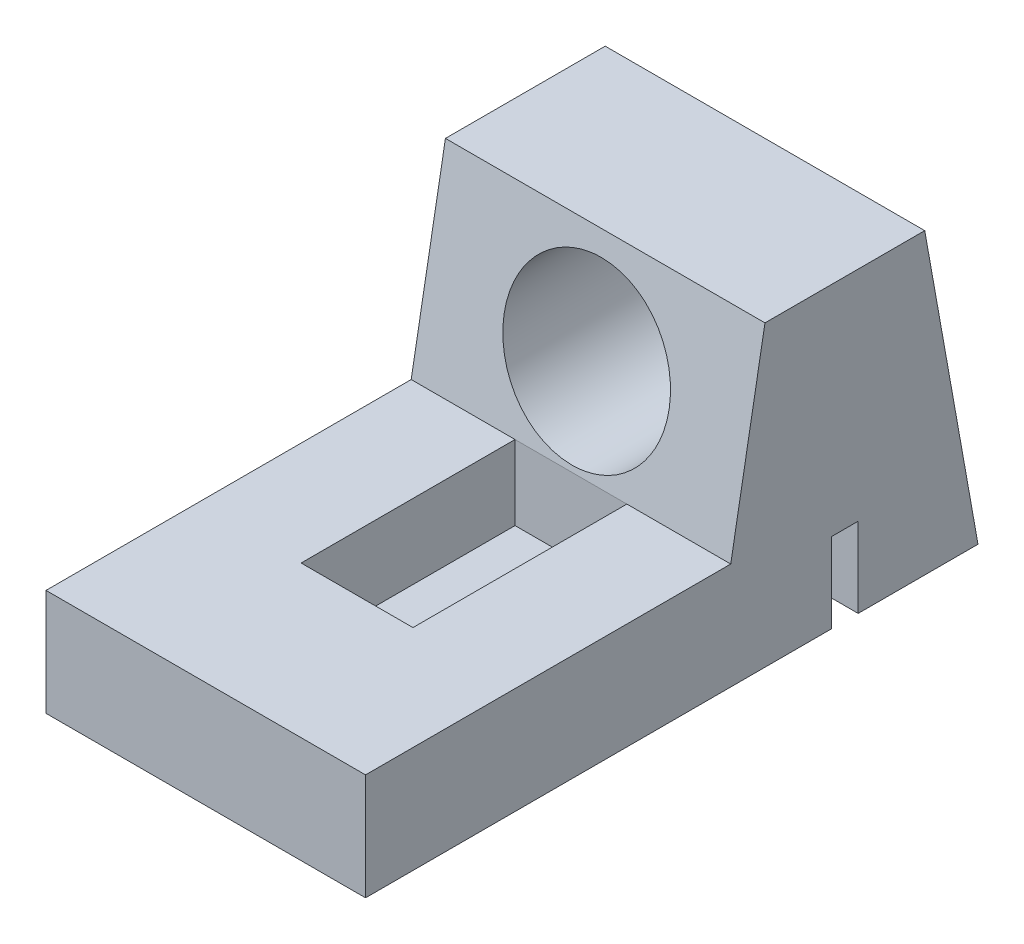
ISO-10303-21;
HEADER;
FILE_DESCRIPTION(('STEP AP214'),'2;1');
FILE_NAME('part.step','',(''),(''),'','','');
FILE_SCHEMA(('AUTOMOTIVE_DESIGN { 1 0 10303 214 1 1 1 1 }'));
ENDSEC;
DATA;
#1=APPLICATION_CONTEXT('core data for automotive mechanical design processes');
#2=APPLICATION_PROTOCOL_DEFINITION('international standard','automotive_design',2000,#1);
#3=PRODUCT_CONTEXT('',#1,'mechanical');
#4=PRODUCT('Part','Part','',(#3));
#5=PRODUCT_RELATED_PRODUCT_CATEGORY('part','',(#4));
#6=PRODUCT_DEFINITION_FORMATION('','',#4);
#7=PRODUCT_DEFINITION_CONTEXT('part definition',#1,'design');
#8=PRODUCT_DEFINITION('design','',#6,#7);
#9=PRODUCT_DEFINITION_SHAPE('','',#8);
#10=(LENGTH_UNIT() NAMED_UNIT(*) SI_UNIT(.MILLI.,.METRE.));
#11=(NAMED_UNIT(*) PLANE_ANGLE_UNIT() SI_UNIT($,.RADIAN.));
#12=(NAMED_UNIT(*) SI_UNIT($,.STERADIAN.) SOLID_ANGLE_UNIT());
#13=UNCERTAINTY_MEASURE_WITH_UNIT(LENGTH_MEASURE(1.E-05),#10,'distance_accuracy_value','');
#14=(GEOMETRIC_REPRESENTATION_CONTEXT(3) GLOBAL_UNCERTAINTY_ASSIGNED_CONTEXT((#13)) GLOBAL_UNIT_ASSIGNED_CONTEXT((#10,
#11,#12)) REPRESENTATION_CONTEXT('',''));
#15=CARTESIAN_POINT('',(0.,0.,0.));
#16=DIRECTION('',(0.,0.,1.));
#17=DIRECTION('',(1.,0.,0.));
#18=AXIS2_PLACEMENT_3D('',#15,#16,#17);
#19=CARTESIAN_POINT('',(0.,-31.454396412768,0.));
#20=DIRECTION('',(0.,-1.,0.));
#21=DIRECTION('',(0.,0.,-1.));
#22=AXIS2_PLACEMENT_3D('',#19,#20,#21);
#23=PLANE('',#22);
#24=DIRECTION('',(0.,0.,1.));
#25=VECTOR('',#24,1.);
#26=CARTESIAN_POINT('',(40.5,-31.454396412768,0.));
#27=LINE('',#26,#25);
#28=CARTESIAN_POINT('',(40.5,-31.454396412768,21.4285714285714));
#29=VERTEX_POINT('',#28);
#30=CARTESIAN_POINT('',(40.5,-31.454396412768,61.5985714285714));
#31=VERTEX_POINT('',#30);
#32=EDGE_CURVE('E48',#29,#31,#27,.T.);
#33=ORIENTED_EDGE('',*,*,#32,.T.);
#34=DIRECTION('',(-1.,0.,0.));
#35=VECTOR('',#34,1.);
#36=CARTESIAN_POINT('',(0.,-31.454396412768,61.5985714285714));
#37=LINE('',#36,#35);
#38=CARTESIAN_POINT('',(19.5,-31.454396412768,61.5985714285714));
#39=VERTEX_POINT('',#38);
#40=EDGE_CURVE('E155',#31,#39,#37,.T.);
#41=ORIENTED_EDGE('',*,*,#40,.T.);
#42=DIRECTION('',(0.,0.,-1.));
#43=VECTOR('',#42,1.);
#44=CARTESIAN_POINT('',(19.5,-31.454396412768,0.));
#45=LINE('',#44,#43);
#46=CARTESIAN_POINT('',(19.5,-31.454396412768,21.4285714285714));
#47=VERTEX_POINT('',#46);
#48=EDGE_CURVE('E242',#39,#47,#45,.T.);
#49=ORIENTED_EDGE('',*,*,#48,.T.);
#50=DIRECTION('',(-1.,0.,0.));
#51=VECTOR('',#50,1.);
#52=CARTESIAN_POINT('',(60.,-31.454396412768,21.4285714285714));
#53=LINE('',#52,#51);
#54=CARTESIAN_POINT('',(0.,-31.454396412768,21.4285714285714));
#55=VERTEX_POINT('',#54);
#56=EDGE_CURVE('E41',#47,#55,#53,.T.);
#57=ORIENTED_EDGE('',*,*,#56,.T.);
#58=DIRECTION('',(0.,0.,-1.));
#59=VECTOR('',#58,1.);
#60=CARTESIAN_POINT('',(0.,-31.454396412768,4.57508133052897));
#61=LINE('',#60,#59);
#62=CARTESIAN_POINT('',(0.,-31.454396412768,90.));
#63=VERTEX_POINT('',#62);
#64=EDGE_CURVE('E170',#63,#55,#61,.T.);
#65=ORIENTED_EDGE('',*,*,#64,.F.);
#66=DIRECTION('',(-1.,0.,0.));
#67=VECTOR('',#66,1.);
#68=CARTESIAN_POINT('',(60.,-31.454396412768,90.));
#69=LINE('',#68,#67);
#70=CARTESIAN_POINT('',(60.,-31.454396412768,90.));
#71=VERTEX_POINT('',#70);
#72=EDGE_CURVE('E167',#71,#63,#69,.T.);
#73=ORIENTED_EDGE('',*,*,#72,.F.);
#74=DIRECTION('',(0.,0.,1.));
#75=VECTOR('',#74,1.);
#76=CARTESIAN_POINT('',(60.,-31.454396412768,4.57508133052897));
#77=LINE('',#76,#75);
#78=CARTESIAN_POINT('',(60.,-31.454396412768,21.4285714285714));
#79=VERTEX_POINT('',#78);
#80=EDGE_CURVE('E160',#79,#71,#77,.T.);
#81=ORIENTED_EDGE('',*,*,#80,.F.);
#82=EDGE_CURVE('E11',#79,#29,#53,.T.);
#83=ORIENTED_EDGE('',*,*,#82,.T.);
#84=EDGE_LOOP('',(#33,#41,#49,#57,#65,#73,#81,#83));
#85=FACE_BOUND('',#84,.T.);
#86=ADVANCED_FACE('F33',(#85),#23,.F.);
#87=CARTESIAN_POINT('',(60.,4.545603587232,15.));
#88=DIRECTION('',(0.,-0.175790638483658,-0.984427575508482));
#89=DIRECTION('',(0.,0.984427575508482,-0.175790638483658));
#90=AXIS2_PLACEMENT_3D('',#87,#88,#89);
#91=PLANE('',#90);
#92=CARTESIAN_POINT('',(30.,-14.954396412768,18.4821428571429));
#93=DIRECTION('',(0.,-0.175790638483658,-0.984427575508482));
#94=DIRECTION('',(0.,-0.984427575508482,0.175790638483658));
#95=AXIS2_PLACEMENT_3D('',#92,#93,#94);
#96=ELLIPSE('',#95,15.7451907947559,15.5);
#97=CARTESIAN_POINT('',(30.,-30.454396412768,21.25));
#98=VERTEX_POINT('',#97);
#99=EDGE_CURVE('E199',#98,#98,#96,.T.);
#100=ORIENTED_EDGE('',*,*,#99,.T.);
#101=EDGE_LOOP('',(#100));
#102=FACE_BOUND('',#101,.T.);
#103=ORIENTED_EDGE('',*,*,#82,.F.);
#104=DIRECTION('',(0.,-0.984427575508482,0.175790638483658));
#105=VECTOR('',#104,1.);
#106=CARTESIAN_POINT('',(60.,4.545603587232,15.));
#107=LINE('',#106,#105);
#108=CARTESIAN_POINT('',(60.,4.545603587232,15.));
#109=VERTEX_POINT('',#108);
#110=EDGE_CURVE('E203',#109,#79,#107,.T.);
#111=ORIENTED_EDGE('',*,*,#110,.F.);
#112=DIRECTION('',(-1.,0.,0.));
#113=VECTOR('',#112,1.);
#114=CARTESIAN_POINT('',(60.,4.545603587232,15.));
#115=LINE('',#114,#113);
#116=CARTESIAN_POINT('',(0.,4.545603587232,15.));
#117=VERTEX_POINT('',#116);
#118=EDGE_CURVE('E214',#109,#117,#115,.T.);
#119=ORIENTED_EDGE('',*,*,#118,.T.);
#120=DIRECTION('',(0.,-0.984427575508482,0.175790638483658));
#121=VECTOR('',#120,1.);
#122=CARTESIAN_POINT('',(0.,4.545603587232,15.));
#123=LINE('',#122,#121);
#124=EDGE_CURVE('E202',#117,#55,#123,.T.);
#125=ORIENTED_EDGE('',*,*,#124,.T.);
#126=ORIENTED_EDGE('',*,*,#56,.F.);
#127=DIRECTION('',(1.,0.,0.));
#128=VECTOR('',#127,1.);
#129=CARTESIAN_POINT('',(0.,-31.454396412768,21.4285714285714));
#130=LINE('',#129,#128);
#131=EDGE_CURVE('E151',#47,#29,#130,.T.);
#132=ORIENTED_EDGE('',*,*,#131,.T.);
#133=EDGE_LOOP('',(#103,#111,#119,#125,#126,#132));
#134=FACE_BOUND('',#133,.T.);
#135=ADVANCED_FACE('F35',(#102,#134),#91,.F.);
#136=CARTESIAN_POINT('',(60.,-51.454396412768,25.));
#137=DIRECTION('',(0.,1.,0.));
#138=DIRECTION('',(0.,0.,1.));
#139=AXIS2_PLACEMENT_3D('',#136,#137,#138);
#140=PLANE('',#139);
#141=DIRECTION('',(-1.,0.,0.));
#142=VECTOR('',#141,1.);
#143=CARTESIAN_POINT('',(60.,-51.454396412768,2.5));
#144=LINE('',#143,#142);
#145=CARTESIAN_POINT('',(60.,-51.454396412768,2.5));
#146=VERTEX_POINT('',#145);
#147=CARTESIAN_POINT('',(0.,-51.454396412768,2.5));
#148=VERTEX_POINT('',#147);
#149=EDGE_CURVE('E196',#146,#148,#144,.T.);
#150=ORIENTED_EDGE('',*,*,#149,.F.);
#151=DIRECTION('',(0.,0.,-1.));
#152=VECTOR('',#151,1.);
#153=CARTESIAN_POINT('',(60.,-51.454396412768,25.));
#154=LINE('',#153,#152);
#155=CARTESIAN_POINT('',(60.,-51.454396412768,90.));
#156=VERTEX_POINT('',#155);
#157=EDGE_CURVE('E208',#156,#146,#154,.T.);
#158=ORIENTED_EDGE('',*,*,#157,.F.);
#159=DIRECTION('',(-1.,0.,0.));
#160=VECTOR('',#159,1.);
#161=CARTESIAN_POINT('',(60.,-51.454396412768,90.));
#162=LINE('',#161,#160);
#163=CARTESIAN_POINT('',(0.,-51.454396412768,90.));
#164=VERTEX_POINT('',#163);
#165=EDGE_CURVE('E156',#156,#164,#162,.T.);
#166=ORIENTED_EDGE('',*,*,#165,.T.);
#167=DIRECTION('',(0.,0.,-1.));
#168=VECTOR('',#167,1.);
#169=CARTESIAN_POINT('',(0.,-51.454396412768,25.));
#170=LINE('',#169,#168);
#171=EDGE_CURVE('E218',#164,#148,#170,.T.);
#172=ORIENTED_EDGE('',*,*,#171,.T.);
#173=EDGE_LOOP('',(#150,#158,#166,#172));
#174=FACE_BOUND('',#173,.T.);
#175=ADVANCED_FACE('F278',(#174),#140,.F.);
#176=DIRECTION('',(1.,0.,0.));
#177=VECTOR('',#176,1.);
#178=CARTESIAN_POINT('',(60.,-51.454396412768,-2.5));
#179=LINE('',#178,#177);
#180=CARTESIAN_POINT('',(0.,-51.454396412768,-2.5));
#181=VERTEX_POINT('',#180);
#182=CARTESIAN_POINT('',(60.,-51.454396412768,-2.5));
#183=VERTEX_POINT('',#182);
#184=EDGE_CURVE('E194',#181,#183,#179,.T.);
#185=ORIENTED_EDGE('',*,*,#184,.F.);
#186=CARTESIAN_POINT('',(0.,-51.454396412768,-25.));
#187=VERTEX_POINT('',#186);
#188=EDGE_CURVE('E217',#181,#187,#170,.T.);
#189=ORIENTED_EDGE('',*,*,#188,.T.);
#190=DIRECTION('',(-1.,0.,0.));
#191=VECTOR('',#190,1.);
#192=CARTESIAN_POINT('',(60.,-51.454396412768,-25.));
#193=LINE('',#192,#191);
#194=CARTESIAN_POINT('',(60.,-51.454396412768,-25.));
#195=VERTEX_POINT('',#194);
#196=EDGE_CURVE('E228',#195,#187,#193,.T.);
#197=ORIENTED_EDGE('',*,*,#196,.F.);
#198=EDGE_CURVE('E206',#183,#195,#154,.T.);
#199=ORIENTED_EDGE('',*,*,#198,.F.);
#200=EDGE_LOOP('',(#185,#189,#197,#199));
#201=FACE_BOUND('',#200,.T.);
#202=ADVANCED_FACE('F264',(#201),#140,.F.);
#203=CARTESIAN_POINT('',(60.,0.,0.));
#204=DIRECTION('',(1.,0.,0.));
#205=DIRECTION('',(0.,0.,-1.));
#206=AXIS2_PLACEMENT_3D('',#203,#204,#205);
#207=PLANE('',#206);
#208=ORIENTED_EDGE('',*,*,#157,.T.);
#209=DIRECTION('',(0.,-1.,0.));
#210=VECTOR('',#209,1.);
#211=CARTESIAN_POINT('',(60.,-66.454396412768,2.5));
#212=LINE('',#211,#210);
#213=CARTESIAN_POINT('',(60.,-36.454396412768,2.5));
#214=VERTEX_POINT('',#213);
#215=EDGE_CURVE('E179',#214,#146,#212,.T.);
#216=ORIENTED_EDGE('',*,*,#215,.F.);
#217=DIRECTION('',(0.,0.,1.));
#218=VECTOR('',#217,1.);
#219=CARTESIAN_POINT('',(60.,-36.454396412768,-2.5));
#220=LINE('',#219,#218);
#221=CARTESIAN_POINT('',(60.,-36.454396412768,-2.5));
#222=VERTEX_POINT('',#221);
#223=EDGE_CURVE('E185',#222,#214,#220,.T.);
#224=ORIENTED_EDGE('',*,*,#223,.F.);
#225=DIRECTION('',(0.,1.,0.));
#226=VECTOR('',#225,1.);
#227=CARTESIAN_POINT('',(60.,-66.454396412768,-2.5));
#228=LINE('',#227,#226);
#229=EDGE_CURVE('E182',#183,#222,#228,.T.);
#230=ORIENTED_EDGE('',*,*,#229,.F.);
#231=ORIENTED_EDGE('',*,*,#198,.T.);
#232=DIRECTION('',(0.,0.984427575508482,0.175790638483657));
#233=VECTOR('',#232,1.);
#234=CARTESIAN_POINT('',(60.,4.54560358723201,-15.));
#235=LINE('',#234,#233);
#236=CARTESIAN_POINT('',(60.,4.54560358723201,-15.));
#237=VERTEX_POINT('',#236);
#238=EDGE_CURVE('E210',#195,#237,#235,.T.);
#239=ORIENTED_EDGE('',*,*,#238,.T.);
#240=DIRECTION('',(0.,0.,1.));
#241=VECTOR('',#240,1.);
#242=CARTESIAN_POINT('',(60.,4.545603587232,15.));
#243=LINE('',#242,#241);
#244=EDGE_CURVE('E212',#237,#109,#243,.T.);
#245=ORIENTED_EDGE('',*,*,#244,.T.);
#246=ORIENTED_EDGE('',*,*,#110,.T.);
#247=ORIENTED_EDGE('',*,*,#80,.T.);
#248=DIRECTION('',(0.,-1.,0.));
#249=VECTOR('',#248,1.);
#250=CARTESIAN_POINT('',(60.,-31.454396412768,90.));
#251=LINE('',#250,#249);
#252=EDGE_CURVE('E172',#71,#156,#251,.T.);
#253=ORIENTED_EDGE('',*,*,#252,.T.);
#254=EDGE_LOOP('',(#208,#216,#224,#230,#231,#239,#245,#246,#247,#253));
#255=FACE_BOUND('',#254,.T.);
#256=ADVANCED_FACE('F270',(#255),#207,.T.);
#257=CARTESIAN_POINT('',(0.,0.,0.));
#258=DIRECTION('',(1.,0.,0.));
#259=DIRECTION('',(0.,0.,-1.));
#260=AXIS2_PLACEMENT_3D('',#257,#258,#259);
#261=PLANE('',#260);
#262=DIRECTION('',(0.,-1.,0.));
#263=VECTOR('',#262,1.);
#264=CARTESIAN_POINT('',(0.,-66.454396412768,2.5));
#265=LINE('',#264,#263);
#266=CARTESIAN_POINT('',(0.,-36.454396412768,2.5));
#267=VERTEX_POINT('',#266);
#268=EDGE_CURVE('E56',#267,#148,#265,.T.);
#269=ORIENTED_EDGE('',*,*,#268,.T.);
#270=ORIENTED_EDGE('',*,*,#171,.F.);
#271=DIRECTION('',(0.,-1.,0.));
#272=VECTOR('',#271,1.);
#273=CARTESIAN_POINT('',(0.,-31.454396412768,90.));
#274=LINE('',#273,#272);
#275=EDGE_CURVE('E174',#63,#164,#274,.T.);
#276=ORIENTED_EDGE('',*,*,#275,.F.);
#277=ORIENTED_EDGE('',*,*,#64,.T.);
#278=ORIENTED_EDGE('',*,*,#124,.F.);
#279=DIRECTION('',(0.,0.,1.));
#280=VECTOR('',#279,1.);
#281=CARTESIAN_POINT('',(0.,4.545603587232,15.));
#282=LINE('',#281,#280);
#283=CARTESIAN_POINT('',(0.,4.54560358723201,-15.));
#284=VERTEX_POINT('',#283);
#285=EDGE_CURVE('E207',#284,#117,#282,.T.);
#286=ORIENTED_EDGE('',*,*,#285,.F.);
#287=DIRECTION('',(0.,0.984427575508482,0.175790638483657));
#288=VECTOR('',#287,1.);
#289=CARTESIAN_POINT('',(0.,4.54560358723201,-15.));
#290=LINE('',#289,#288);
#291=EDGE_CURVE('E220',#187,#284,#290,.T.);
#292=ORIENTED_EDGE('',*,*,#291,.F.);
#293=ORIENTED_EDGE('',*,*,#188,.F.);
#294=DIRECTION('',(0.,-1.,0.));
#295=VECTOR('',#294,1.);
#296=CARTESIAN_POINT('',(0.,0.,-2.5));
#297=LINE('',#296,#295);
#298=CARTESIAN_POINT('',(0.,-36.454396412768,-2.5));
#299=VERTEX_POINT('',#298);
#300=EDGE_CURVE('E231',#299,#181,#297,.T.);
#301=ORIENTED_EDGE('',*,*,#300,.F.);
#302=DIRECTION('',(0.,0.,1.));
#303=VECTOR('',#302,1.);
#304=CARTESIAN_POINT('',(0.,-36.454396412768,-2.5));
#305=LINE('',#304,#303);
#306=EDGE_CURVE('E183',#299,#267,#305,.T.);
#307=ORIENTED_EDGE('',*,*,#306,.T.);
#308=EDGE_LOOP('',(#269,#270,#276,#277,#278,#286,#292,#293,#301,#307));
#309=FACE_BOUND('',#308,.T.);
#310=ADVANCED_FACE('F247',(#309),#261,.F.);
#311=CARTESIAN_POINT('',(60.,4.54560358723201,-15.));
#312=DIRECTION('',(0.,-0.175790638483657,0.984427575508482));
#313=DIRECTION('',(0.,-0.984427575508482,-0.175790638483657));
#314=AXIS2_PLACEMENT_3D('',#311,#312,#313);
#315=PLANE('',#314);
#316=CARTESIAN_POINT('',(30.,-14.954396412768,-18.4821428571429));
#317=DIRECTION('',(0.,-0.175790638483657,0.984427575508482));
#318=DIRECTION('',(0.,0.984427575508482,0.175790638483657));
#319=AXIS2_PLACEMENT_3D('',#316,#317,#318);
#320=ELLIPSE('',#319,15.7451907947559,15.5);
#321=CARTESIAN_POINT('',(30.,0.545603587232008,-15.7142857142857));
#322=VERTEX_POINT('',#321);
#323=EDGE_CURVE('E198',#322,#322,#320,.T.);
#324=ORIENTED_EDGE('',*,*,#323,.T.);
#325=EDGE_LOOP('',(#324));
#326=FACE_BOUND('',#325,.T.);
#327=ORIENTED_EDGE('',*,*,#291,.T.);
#328=DIRECTION('',(-1.,0.,0.));
#329=VECTOR('',#328,1.);
#330=CARTESIAN_POINT('',(60.,4.54560358723201,-15.));
#331=LINE('',#330,#329);
#332=EDGE_CURVE('E225',#237,#284,#331,.T.);
#333=ORIENTED_EDGE('',*,*,#332,.F.);
#334=ORIENTED_EDGE('',*,*,#238,.F.);
#335=ORIENTED_EDGE('',*,*,#196,.T.);
#336=EDGE_LOOP('',(#327,#333,#334,#335));
#337=FACE_BOUND('',#336,.T.);
#338=ADVANCED_FACE('F259',(#326,#337),#315,.F.);
#339=CARTESIAN_POINT('',(60.,4.545603587232,15.));
#340=DIRECTION('',(0.,-1.,0.));
#341=DIRECTION('',(0.,0.,-1.));
#342=AXIS2_PLACEMENT_3D('',#339,#340,#341);
#343=PLANE('',#342);
#344=ORIENTED_EDGE('',*,*,#285,.T.);
#345=ORIENTED_EDGE('',*,*,#118,.F.);
#346=ORIENTED_EDGE('',*,*,#244,.F.);
#347=ORIENTED_EDGE('',*,*,#332,.T.);
#348=EDGE_LOOP('',(#344,#345,#346,#347));
#349=FACE_BOUND('',#348,.T.);
#350=ADVANCED_FACE('F254',(#349),#343,.F.);
#351=CARTESIAN_POINT('',(30.,-14.954396412768,-29.));
#352=DIRECTION('',(0.,0.,1.));
#353=DIRECTION('',(1.,0.,0.));
#354=AXIS2_PLACEMENT_3D('',#351,#352,#353);
#355=CYLINDRICAL_SURFACE('',#354,15.5);
#356=ORIENTED_EDGE('',*,*,#323,.F.);
#357=EDGE_LOOP('',(#356));
#358=FACE_BOUND('',#357,.T.);
#359=ORIENTED_EDGE('',*,*,#99,.F.);
#360=EDGE_LOOP('',(#359));
#361=FACE_BOUND('',#360,.T.);
#362=ADVANCED_FACE('F322',(#358,#361),#355,.F.);
#363=CARTESIAN_POINT('',(60.,-66.454396412768,2.5));
#364=DIRECTION('',(0.,0.,-1.));
#365=DIRECTION('',(-1.,0.,0.));
#366=AXIS2_PLACEMENT_3D('',#363,#364,#365);
#367=PLANE('',#366);
#368=ORIENTED_EDGE('',*,*,#149,.T.);
#369=ORIENTED_EDGE('',*,*,#268,.F.);
#370=DIRECTION('',(-1.,0.,0.));
#371=VECTOR('',#370,1.);
#372=CARTESIAN_POINT('',(60.,-36.454396412768,2.5));
#373=LINE('',#372,#371);
#374=EDGE_CURVE('E187',#214,#267,#373,.T.);
#375=ORIENTED_EDGE('',*,*,#374,.F.);
#376=ORIENTED_EDGE('',*,*,#215,.T.);
#377=EDGE_LOOP('',(#368,#369,#375,#376));
#378=FACE_BOUND('',#377,.T.);
#379=ADVANCED_FACE('F275',(#378),#367,.T.);
#380=CARTESIAN_POINT('',(60.,-66.454396412768,-2.5));
#381=DIRECTION('',(0.,0.,1.));
#382=DIRECTION('',(1.,0.,0.));
#383=AXIS2_PLACEMENT_3D('',#380,#381,#382);
#384=PLANE('',#383);
#385=ORIENTED_EDGE('',*,*,#184,.T.);
#386=ORIENTED_EDGE('',*,*,#229,.T.);
#387=DIRECTION('',(-1.,0.,0.));
#388=VECTOR('',#387,1.);
#389=CARTESIAN_POINT('',(60.,-36.454396412768,-2.5));
#390=LINE('',#389,#388);
#391=EDGE_CURVE('E192',#222,#299,#390,.T.);
#392=ORIENTED_EDGE('',*,*,#391,.T.);
#393=ORIENTED_EDGE('',*,*,#300,.T.);
#394=EDGE_LOOP('',(#385,#386,#392,#393));
#395=FACE_BOUND('',#394,.T.);
#396=ADVANCED_FACE('F266',(#395),#384,.T.);
#397=CARTESIAN_POINT('',(60.,-36.454396412768,-2.5));
#398=DIRECTION('',(0.,-1.,0.));
#399=DIRECTION('',(0.,0.,-1.));
#400=AXIS2_PLACEMENT_3D('',#397,#398,#399);
#401=PLANE('',#400);
#402=ORIENTED_EDGE('',*,*,#306,.F.);
#403=ORIENTED_EDGE('',*,*,#391,.F.);
#404=ORIENTED_EDGE('',*,*,#223,.T.);
#405=ORIENTED_EDGE('',*,*,#374,.T.);
#406=EDGE_LOOP('',(#402,#403,#404,#405));
#407=FACE_BOUND('',#406,.T.);
#408=ADVANCED_FACE('F274',(#407),#401,.T.);
#409=CARTESIAN_POINT('',(60.,-31.454396412768,90.));
#410=DIRECTION('',(0.,0.,1.));
#411=DIRECTION('',(0.,-1.,0.));
#412=AXIS2_PLACEMENT_3D('',#409,#410,#411);
#413=PLANE('',#412);
#414=ORIENTED_EDGE('',*,*,#165,.F.);
#415=ORIENTED_EDGE('',*,*,#252,.F.);
#416=ORIENTED_EDGE('',*,*,#72,.T.);
#417=ORIENTED_EDGE('',*,*,#275,.T.);
#418=EDGE_LOOP('',(#414,#415,#416,#417));
#419=FACE_BOUND('',#418,.T.);
#420=ADVANCED_FACE('F281',(#419),#413,.T.);
#421=CARTESIAN_POINT('',(40.5,-45.454396412768,0.));
#422=DIRECTION('',(-1.,0.,0.));
#423=DIRECTION('',(0.,0.,1.));
#424=AXIS2_PLACEMENT_3D('',#421,#422,#423);
#425=PLANE('',#424);
#426=ORIENTED_EDGE('',*,*,#32,.F.);
#427=DIRECTION('',(0.,1.,0.));
#428=VECTOR('',#427,1.);
#429=CARTESIAN_POINT('',(40.5,-45.454396412768,21.4285714285714));
#430=LINE('',#429,#428);
#431=CARTESIAN_POINT('',(40.5,-45.454396412768,21.4285714285714));
#432=VERTEX_POINT('',#431);
#433=EDGE_CURVE('E150',#432,#29,#430,.T.);
#434=ORIENTED_EDGE('',*,*,#433,.F.);
#435=DIRECTION('',(0.,0.,1.));
#436=VECTOR('',#435,1.);
#437=CARTESIAN_POINT('',(40.5,-45.454396412768,0.));
#438=LINE('',#437,#436);
#439=CARTESIAN_POINT('',(40.5,-45.454396412768,61.5985714285714));
#440=VERTEX_POINT('',#439);
#441=EDGE_CURVE('E142',#432,#440,#438,.T.);
#442=ORIENTED_EDGE('',*,*,#441,.T.);
#443=DIRECTION('',(0.,1.,0.));
#444=VECTOR('',#443,1.);
#445=CARTESIAN_POINT('',(40.5,-45.454396412768,61.5985714285714));
#446=LINE('',#445,#444);
#447=EDGE_CURVE('E149',#440,#31,#446,.T.);
#448=ORIENTED_EDGE('',*,*,#447,.T.);
#449=EDGE_LOOP('',(#426,#434,#442,#448));
#450=FACE_BOUND('',#449,.T.);
#451=ADVANCED_FACE('F148',(#450),#425,.T.);
#452=CARTESIAN_POINT('',(0.,-45.454396412768,61.5985714285714));
#453=DIRECTION('',(0.,0.,-1.));
#454=DIRECTION('',(-1.,0.,0.));
#455=AXIS2_PLACEMENT_3D('',#452,#453,#454);
#456=PLANE('',#455);
#457=ORIENTED_EDGE('',*,*,#40,.F.);
#458=ORIENTED_EDGE('',*,*,#447,.F.);
#459=DIRECTION('',(-1.,0.,0.));
#460=VECTOR('',#459,1.);
#461=CARTESIAN_POINT('',(0.,-45.454396412768,61.5985714285714));
#462=LINE('',#461,#460);
#463=CARTESIAN_POINT('',(19.5,-45.454396412768,61.5985714285714));
#464=VERTEX_POINT('',#463);
#465=EDGE_CURVE('E138',#440,#464,#462,.T.);
#466=ORIENTED_EDGE('',*,*,#465,.T.);
#467=DIRECTION('',(0.,1.,0.));
#468=VECTOR('',#467,1.);
#469=CARTESIAN_POINT('',(19.5,-45.454396412768,61.5985714285714));
#470=LINE('',#469,#468);
#471=EDGE_CURVE('E157',#464,#39,#470,.T.);
#472=ORIENTED_EDGE('',*,*,#471,.T.);
#473=EDGE_LOOP('',(#457,#458,#466,#472));
#474=FACE_BOUND('',#473,.T.);
#475=ADVANCED_FACE('F153',(#474),#456,.T.);
#476=CARTESIAN_POINT('',(19.5,-45.454396412768,0.));
#477=DIRECTION('',(1.,0.,0.));
#478=DIRECTION('',(0.,0.,-1.));
#479=AXIS2_PLACEMENT_3D('',#476,#477,#478);
#480=PLANE('',#479);
#481=ORIENTED_EDGE('',*,*,#48,.F.);
#482=ORIENTED_EDGE('',*,*,#471,.F.);
#483=DIRECTION('',(0.,0.,-1.));
#484=VECTOR('',#483,1.);
#485=CARTESIAN_POINT('',(19.5,-45.454396412768,0.));
#486=LINE('',#485,#484);
#487=CARTESIAN_POINT('',(19.5,-45.454396412768,21.4285714285714));
#488=VERTEX_POINT('',#487);
#489=EDGE_CURVE('E143',#464,#488,#486,.T.);
#490=ORIENTED_EDGE('',*,*,#489,.T.);
#491=DIRECTION('',(0.,1.,0.));
#492=VECTOR('',#491,1.);
#493=CARTESIAN_POINT('',(19.5,-45.454396412768,21.4285714285714));
#494=LINE('',#493,#492);
#495=EDGE_CURVE('E162',#488,#47,#494,.T.);
#496=ORIENTED_EDGE('',*,*,#495,.T.);
#497=EDGE_LOOP('',(#481,#482,#490,#496));
#498=FACE_BOUND('',#497,.T.);
#499=ADVANCED_FACE('F292',(#498),#480,.T.);
#500=CARTESIAN_POINT('',(0.,-45.454396412768,21.4285714285714));
#501=DIRECTION('',(0.,0.,1.));
#502=DIRECTION('',(1.,0.,0.));
#503=AXIS2_PLACEMENT_3D('',#500,#501,#502);
#504=PLANE('',#503);
#505=ORIENTED_EDGE('',*,*,#131,.F.);
#506=ORIENTED_EDGE('',*,*,#495,.F.);
#507=DIRECTION('',(1.,0.,0.));
#508=VECTOR('',#507,1.);
#509=CARTESIAN_POINT('',(0.,-45.454396412768,21.4285714285714));
#510=LINE('',#509,#508);
#511=EDGE_CURVE('E290',#488,#432,#510,.T.);
#512=ORIENTED_EDGE('',*,*,#511,.T.);
#513=ORIENTED_EDGE('',*,*,#433,.T.);
#514=EDGE_LOOP('',(#505,#506,#512,#513));
#515=FACE_BOUND('',#514,.T.);
#516=ADVANCED_FACE('F293',(#515),#504,.T.);
#517=CARTESIAN_POINT('',(0.,-45.454396412768,0.));
#518=DIRECTION('',(0.,-1.,0.));
#519=DIRECTION('',(0.,0.,-1.));
#520=AXIS2_PLACEMENT_3D('',#517,#518,#519);
#521=PLANE('',#520);
#522=ORIENTED_EDGE('',*,*,#441,.F.);
#523=ORIENTED_EDGE('',*,*,#511,.F.);
#524=ORIENTED_EDGE('',*,*,#489,.F.);
#525=ORIENTED_EDGE('',*,*,#465,.F.);
#526=EDGE_LOOP('',(#522,#523,#524,#525));
#527=FACE_BOUND('',#526,.T.);
#528=ADVANCED_FACE('F140',(#527),#521,.F.);
#529=CLOSED_SHELL('',(#86,#135,#175,#202,#256,#310,#338,#350,#362,#379,#396,#408,#420,#451,#475,
#499,#516,#528));
#530=MANIFOLD_SOLID_BREP('B2',#529);
#531=ADVANCED_BREP_SHAPE_REPRESENTATION('',(#18,#530),#14);
#532=SHAPE_DEFINITION_REPRESENTATION(#9,#531);
ENDSEC;
END-ISO-10303-21;
